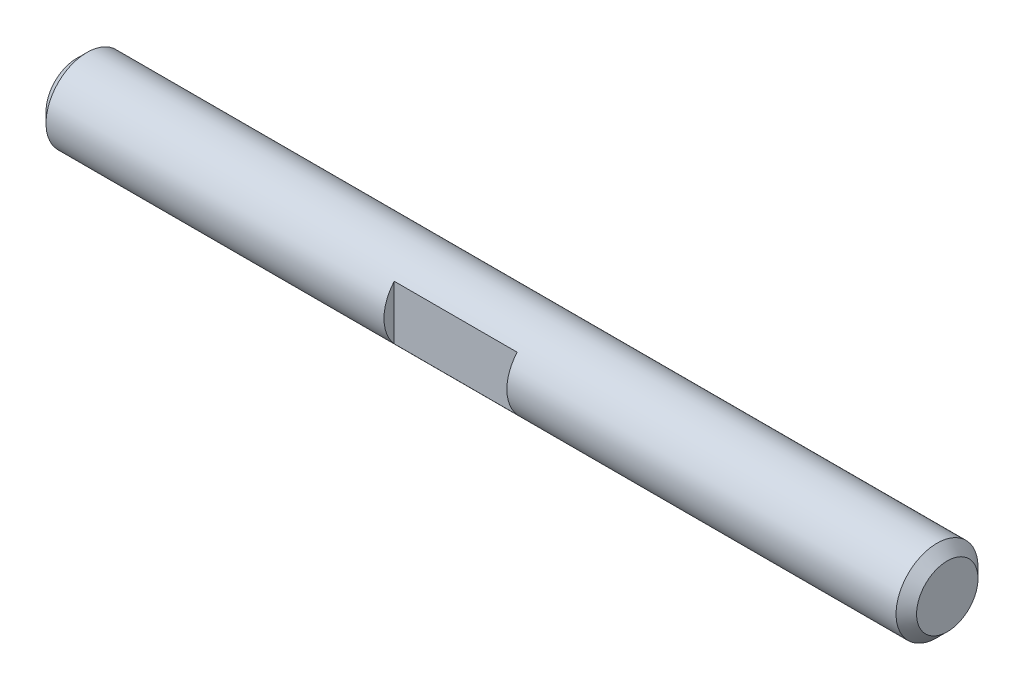
ISO-10303-21;
HEADER;
FILE_DESCRIPTION(('STEP AP214'),'2;1');
FILE_NAME('part.step','',(''),(''),'','','');
FILE_SCHEMA(('AUTOMOTIVE_DESIGN { 1 0 10303 214 1 1 1 1 }'));
ENDSEC;
DATA;
#1=APPLICATION_CONTEXT('core data for automotive mechanical design processes');
#2=APPLICATION_PROTOCOL_DEFINITION('international standard','automotive_design',2000,#1);
#3=PRODUCT_CONTEXT('',#1,'mechanical');
#4=PRODUCT('Part','Part','',(#3));
#5=PRODUCT_RELATED_PRODUCT_CATEGORY('part','',(#4));
#6=PRODUCT_DEFINITION_FORMATION('','',#4);
#7=PRODUCT_DEFINITION_CONTEXT('part definition',#1,'design');
#8=PRODUCT_DEFINITION('design','',#6,#7);
#9=PRODUCT_DEFINITION_SHAPE('','',#8);
#10=(LENGTH_UNIT() NAMED_UNIT(*) SI_UNIT(.MILLI.,.METRE.));
#11=(NAMED_UNIT(*) PLANE_ANGLE_UNIT() SI_UNIT($,.RADIAN.));
#12=(NAMED_UNIT(*) SI_UNIT($,.STERADIAN.) SOLID_ANGLE_UNIT());
#13=UNCERTAINTY_MEASURE_WITH_UNIT(LENGTH_MEASURE(1.E-05),#10,'distance_accuracy_value','');
#14=(GEOMETRIC_REPRESENTATION_CONTEXT(3) GLOBAL_UNCERTAINTY_ASSIGNED_CONTEXT((#13)) GLOBAL_UNIT_ASSIGNED_CONTEXT((#10,
#11,#12)) REPRESENTATION_CONTEXT('',''));
#15=CARTESIAN_POINT('',(0.,0.,0.));
#16=DIRECTION('',(0.,0.,1.));
#17=DIRECTION('',(1.,0.,0.));
#18=AXIS2_PLACEMENT_3D('',#15,#16,#17);
#19=CARTESIAN_POINT('',(42.5,0.,0.));
#20=DIRECTION('',(1.,0.,0.));
#21=DIRECTION('',(0.,0.,-1.));
#22=AXIS2_PLACEMENT_3D('',#19,#20,#21);
#23=CYLINDRICAL_SURFACE('',#22,2.);
#24=CARTESIAN_POINT('',(42.,0.,0.));
#25=DIRECTION('',(1.,0.,0.));
#26=DIRECTION('',(0.,0.,-1.));
#27=AXIS2_PLACEMENT_3D('',#24,#25,#26);
#28=CIRCLE('',#27,2.);
#29=CARTESIAN_POINT('',(42.,0.,-2.));
#30=VERTEX_POINT('',#29);
#31=EDGE_CURVE('E77',#30,#30,#28,.T.);
#32=ORIENTED_EDGE('',*,*,#31,.F.);
#33=EDGE_LOOP('',(#32));
#34=FACE_BOUND('',#33,.T.);
#35=CARTESIAN_POINT('',(0.5,0.,0.));
#36=DIRECTION('',(1.,0.,0.));
#37=DIRECTION('',(0.,0.,-1.));
#38=AXIS2_PLACEMENT_3D('',#35,#36,#37);
#39=CIRCLE('',#38,2.);
#40=CARTESIAN_POINT('',(0.5,0.,-2.));
#41=VERTEX_POINT('',#40);
#42=EDGE_CURVE('E74',#41,#41,#39,.T.);
#43=ORIENTED_EDGE('',*,*,#42,.T.);
#44=EDGE_LOOP('',(#43));
#45=FACE_BOUND('',#44,.T.);
#46=CARTESIAN_POINT('',(23.,0.,0.));
#47=DIRECTION('',(-1.,0.,0.));
#48=DIRECTION('',(0.,-0.661437827766148,0.75));
#49=AXIS2_PLACEMENT_3D('',#46,#47,#48);
#50=CIRCLE('',#49,2.);
#51=CARTESIAN_POINT('',(23.,-1.3228756555323,1.5));
#52=VERTEX_POINT('',#51);
#53=CARTESIAN_POINT('',(23.,1.32287565553229,1.5));
#54=VERTEX_POINT('',#53);
#55=EDGE_CURVE('E65',#52,#54,#50,.T.);
#56=ORIENTED_EDGE('',*,*,#55,.F.);
#57=DIRECTION('',(1.,0.,0.));
#58=VECTOR('',#57,1.);
#59=CARTESIAN_POINT('',(17.,-1.32287565553229,1.5));
#60=LINE('',#59,#58);
#61=CARTESIAN_POINT('',(17.,-1.3228756555323,1.5));
#62=VERTEX_POINT('',#61);
#63=EDGE_CURVE('E54',#62,#52,#60,.T.);
#64=ORIENTED_EDGE('',*,*,#63,.F.);
#65=CARTESIAN_POINT('',(17.,0.,0.));
#66=DIRECTION('',(1.,0.,0.));
#67=DIRECTION('',(0.,0.661437827766148,0.75));
#68=AXIS2_PLACEMENT_3D('',#65,#66,#67);
#69=CIRCLE('',#68,2.);
#70=CARTESIAN_POINT('',(17.,1.3228756555323,1.5));
#71=VERTEX_POINT('',#70);
#72=EDGE_CURVE('E64',#71,#62,#69,.T.);
#73=ORIENTED_EDGE('',*,*,#72,.F.);
#74=DIRECTION('',(-1.,0.,0.));
#75=VECTOR('',#74,1.);
#76=CARTESIAN_POINT('',(23.,1.32287565553229,1.5));
#77=LINE('',#76,#75);
#78=EDGE_CURVE('E73',#54,#71,#77,.T.);
#79=ORIENTED_EDGE('',*,*,#78,.F.);
#80=EDGE_LOOP('',(#56,#64,#73,#79));
#81=FACE_BOUND('',#80,.T.);
#82=DIRECTION('',(1.,0.,0.));
#83=VECTOR('',#82,1.);
#84=CARTESIAN_POINT('',(17.,-0.637600277910515,-1.89564392373896));
#85=LINE('',#84,#83);
#86=CARTESIAN_POINT('',(17.,-0.637600277910515,-1.89564392373896));
#87=VERTEX_POINT('',#86);
#88=CARTESIAN_POINT('',(23.,-0.637600277910515,-1.89564392373896));
#89=VERTEX_POINT('',#88);
#90=EDGE_CURVE('E89',#87,#89,#85,.T.);
#91=ORIENTED_EDGE('',*,*,#90,.F.);
#92=CARTESIAN_POINT('',(17.,0.,0.));
#93=DIRECTION('',(1.,0.,0.));
#94=DIRECTION('',(0.,-0.980237966721403,0.197821961869479));
#95=AXIS2_PLACEMENT_3D('',#92,#93,#94);
#96=CIRCLE('',#95,2.);
#97=CARTESIAN_POINT('',(17.,-1.96047593344281,0.395643923738958));
#98=VERTEX_POINT('',#97);
#99=EDGE_CURVE('E94',#98,#87,#96,.T.);
#100=ORIENTED_EDGE('',*,*,#99,.F.);
#101=DIRECTION('',(-1.,0.,0.));
#102=VECTOR('',#101,1.);
#103=CARTESIAN_POINT('',(23.,-1.96047593344281,0.395643923738958));
#104=LINE('',#103,#102);
#105=CARTESIAN_POINT('',(23.,-1.96047593344281,0.395643923738958));
#106=VERTEX_POINT('',#105);
#107=EDGE_CURVE('E98',#106,#98,#104,.T.);
#108=ORIENTED_EDGE('',*,*,#107,.F.);
#109=CARTESIAN_POINT('',(23.,0.,0.));
#110=DIRECTION('',(-1.,0.,0.));
#111=DIRECTION('',(0.,-0.318800138955257,-0.947821961869479));
#112=AXIS2_PLACEMENT_3D('',#109,#110,#111);
#113=CIRCLE('',#112,2.);
#114=EDGE_CURVE('E33',#89,#106,#113,.T.);
#115=ORIENTED_EDGE('',*,*,#114,.F.);
#116=EDGE_LOOP('',(#91,#100,#108,#115));
#117=FACE_BOUND('',#116,.T.);
#118=ADVANCED_FACE('F16',(#34,#45,#81,#117),#23,.T.);
#119=CARTESIAN_POINT('',(42.,0.,0.));
#120=DIRECTION('',(-1.,0.,0.));
#121=DIRECTION('',(0.,0.,1.));
#122=AXIS2_PLACEMENT_3D('',#119,#120,#121);
#123=CONICAL_SURFACE('',#122,2.,0.785398163397448);
#124=CARTESIAN_POINT('',(42.5,0.,0.));
#125=DIRECTION('',(1.,0.,0.));
#126=DIRECTION('',(0.,0.,-1.));
#127=AXIS2_PLACEMENT_3D('',#124,#125,#126);
#128=CIRCLE('',#127,1.5);
#129=CARTESIAN_POINT('',(42.5,0.,-1.5));
#130=VERTEX_POINT('',#129);
#131=EDGE_CURVE('E106',#130,#130,#128,.T.);
#132=ORIENTED_EDGE('',*,*,#131,.F.);
#133=EDGE_LOOP('',(#132));
#134=FACE_BOUND('',#133,.T.);
#135=ORIENTED_EDGE('',*,*,#31,.T.);
#136=EDGE_LOOP('',(#135));
#137=FACE_BOUND('',#136,.T.);
#138=ADVANCED_FACE('F133',(#134,#137),#123,.T.);
#139=CARTESIAN_POINT('',(0.,0.,0.));
#140=DIRECTION('',(1.,0.,0.));
#141=DIRECTION('',(0.,0.,-1.));
#142=AXIS2_PLACEMENT_3D('',#139,#140,#141);
#143=CONICAL_SURFACE('',#142,1.5,0.785398163397448);
#144=ORIENTED_EDGE('',*,*,#42,.F.);
#145=EDGE_LOOP('',(#144));
#146=FACE_BOUND('',#145,.T.);
#147=CARTESIAN_POINT('',(0.,0.,0.));
#148=DIRECTION('',(1.,0.,0.));
#149=DIRECTION('',(0.,0.,-1.));
#150=AXIS2_PLACEMENT_3D('',#147,#148,#149);
#151=CIRCLE('',#150,1.5);
#152=CARTESIAN_POINT('',(0.,0.,-1.5));
#153=VERTEX_POINT('',#152);
#154=EDGE_CURVE('E70',#153,#153,#151,.T.);
#155=ORIENTED_EDGE('',*,*,#154,.T.);
#156=EDGE_LOOP('',(#155));
#157=FACE_BOUND('',#156,.T.);
#158=ADVANCED_FACE('F122',(#146,#157),#143,.T.);
#159=CARTESIAN_POINT('',(23.,4.,2.));
#160=DIRECTION('',(-1.,0.,0.));
#161=DIRECTION('',(0.,0.,1.));
#162=AXIS2_PLACEMENT_3D('',#159,#160,#161);
#163=PLANE('',#162);
#164=ORIENTED_EDGE('',*,*,#55,.T.);
#165=DIRECTION('',(0.,-1.,0.));
#166=VECTOR('',#165,1.);
#167=CARTESIAN_POINT('',(23.,1.32287565553229,1.5));
#168=LINE('',#167,#166);
#169=EDGE_CURVE('E58',#54,#52,#168,.T.);
#170=ORIENTED_EDGE('',*,*,#169,.T.);
#171=EDGE_LOOP('',(#164,#170));
#172=FACE_BOUND('',#171,.T.);
#173=ADVANCED_FACE('F69',(#172),#163,.T.);
#174=CARTESIAN_POINT('',(23.,4.,1.5));
#175=DIRECTION('',(0.,0.,1.));
#176=DIRECTION('',(1.,0.,0.));
#177=AXIS2_PLACEMENT_3D('',#174,#175,#176);
#178=PLANE('',#177);
#179=ORIENTED_EDGE('',*,*,#63,.T.);
#180=ORIENTED_EDGE('',*,*,#169,.F.);
#181=ORIENTED_EDGE('',*,*,#78,.T.);
#182=DIRECTION('',(0.,-1.,0.));
#183=VECTOR('',#182,1.);
#184=CARTESIAN_POINT('',(17.,1.3228756555323,1.5));
#185=LINE('',#184,#183);
#186=EDGE_CURVE('E60',#71,#62,#185,.T.);
#187=ORIENTED_EDGE('',*,*,#186,.T.);
#188=EDGE_LOOP('',(#179,#180,#181,#187));
#189=FACE_BOUND('',#188,.T.);
#190=ADVANCED_FACE('F56',(#189),#178,.T.);
#191=CARTESIAN_POINT('',(17.,4.,1.5));
#192=DIRECTION('',(1.,0.,0.));
#193=DIRECTION('',(0.,0.,-1.));
#194=AXIS2_PLACEMENT_3D('',#191,#192,#193);
#195=PLANE('',#194);
#196=ORIENTED_EDGE('',*,*,#186,.F.);
#197=ORIENTED_EDGE('',*,*,#72,.T.);
#198=EDGE_LOOP('',(#196,#197));
#199=FACE_BOUND('',#198,.T.);
#200=ADVANCED_FACE('F151',(#199),#195,.T.);
#201=CARTESIAN_POINT('',(23.,-3.29903810567666,2.71410161513775));
#202=DIRECTION('',(0.,-0.866025403784439,-0.5));
#203=DIRECTION('',(0.,0.5,-0.866025403784439));
#204=AXIS2_PLACEMENT_3D('',#201,#202,#203);
#205=PLANE('',#204);
#206=ORIENTED_EDGE('',*,*,#90,.T.);
#207=DIRECTION('',(0.,0.5,-0.866025403784439));
#208=VECTOR('',#207,1.);
#209=CARTESIAN_POINT('',(23.,-1.9604759334428,0.395643923738958));
#210=LINE('',#209,#208);
#211=EDGE_CURVE('E25',#106,#89,#210,.T.);
#212=ORIENTED_EDGE('',*,*,#211,.F.);
#213=ORIENTED_EDGE('',*,*,#107,.T.);
#214=DIRECTION('',(0.,0.5,-0.866025403784439));
#215=VECTOR('',#214,1.);
#216=CARTESIAN_POINT('',(17.,-1.9604759334428,0.395643923738958));
#217=LINE('',#216,#215);
#218=EDGE_CURVE('E11',#98,#87,#217,.T.);
#219=ORIENTED_EDGE('',*,*,#218,.T.);
#220=EDGE_LOOP('',(#206,#212,#213,#219));
#221=FACE_BOUND('',#220,.T.);
#222=ADVANCED_FACE('F154',(#221),#205,.T.);
#223=CARTESIAN_POINT('',(17.,-3.29903810567666,2.71410161513775));
#224=DIRECTION('',(1.,0.,0.));
#225=DIRECTION('',(0.,0.,-1.));
#226=AXIS2_PLACEMENT_3D('',#223,#224,#225);
#227=PLANE('',#226);
#228=ORIENTED_EDGE('',*,*,#99,.T.);
#229=ORIENTED_EDGE('',*,*,#218,.F.);
#230=EDGE_LOOP('',(#228,#229));
#231=FACE_BOUND('',#230,.T.);
#232=ADVANCED_FACE('F158',(#231),#227,.T.);
#233=CARTESIAN_POINT('',(23.,-3.73205080756888,2.46410161513775));
#234=DIRECTION('',(-1.,0.,0.));
#235=DIRECTION('',(0.,0.,1.));
#236=AXIS2_PLACEMENT_3D('',#233,#234,#235);
#237=PLANE('',#236);
#238=ORIENTED_EDGE('',*,*,#211,.T.);
#239=ORIENTED_EDGE('',*,*,#114,.T.);
#240=EDGE_LOOP('',(#238,#239));
#241=FACE_BOUND('',#240,.T.);
#242=ADVANCED_FACE('F130',(#241),#237,.T.);
#243=CARTESIAN_POINT('',(42.5,1.5,0.));
#244=DIRECTION('',(-1.,0.,0.));
#245=DIRECTION('',(0.,0.,1.));
#246=AXIS2_PLACEMENT_3D('',#243,#244,#245);
#247=PLANE('',#246);
#248=ORIENTED_EDGE('',*,*,#131,.T.);
#249=EDGE_LOOP('',(#248));
#250=FACE_BOUND('',#249,.T.);
#251=ADVANCED_FACE('F125',(#250),#247,.F.);
#252=CARTESIAN_POINT('',(0.,0.,0.));
#253=DIRECTION('',(1.,0.,0.));
#254=DIRECTION('',(0.,0.,-1.));
#255=AXIS2_PLACEMENT_3D('',#252,#253,#254);
#256=PLANE('',#255);
#257=ORIENTED_EDGE('',*,*,#154,.F.);
#258=EDGE_LOOP('',(#257));
#259=FACE_BOUND('',#258,.T.);
#260=ADVANCED_FACE('F18',(#259),#256,.F.);
#261=CLOSED_SHELL('',(#118,#138,#158,#173,#190,#200,#222,#232,#242,#251,#260));
#262=MANIFOLD_SOLID_BREP('B1',#261);
#263=ADVANCED_BREP_SHAPE_REPRESENTATION('',(#18,#262),#14);
#264=SHAPE_DEFINITION_REPRESENTATION(#9,#263);
ENDSEC;
END-ISO-10303-21;
